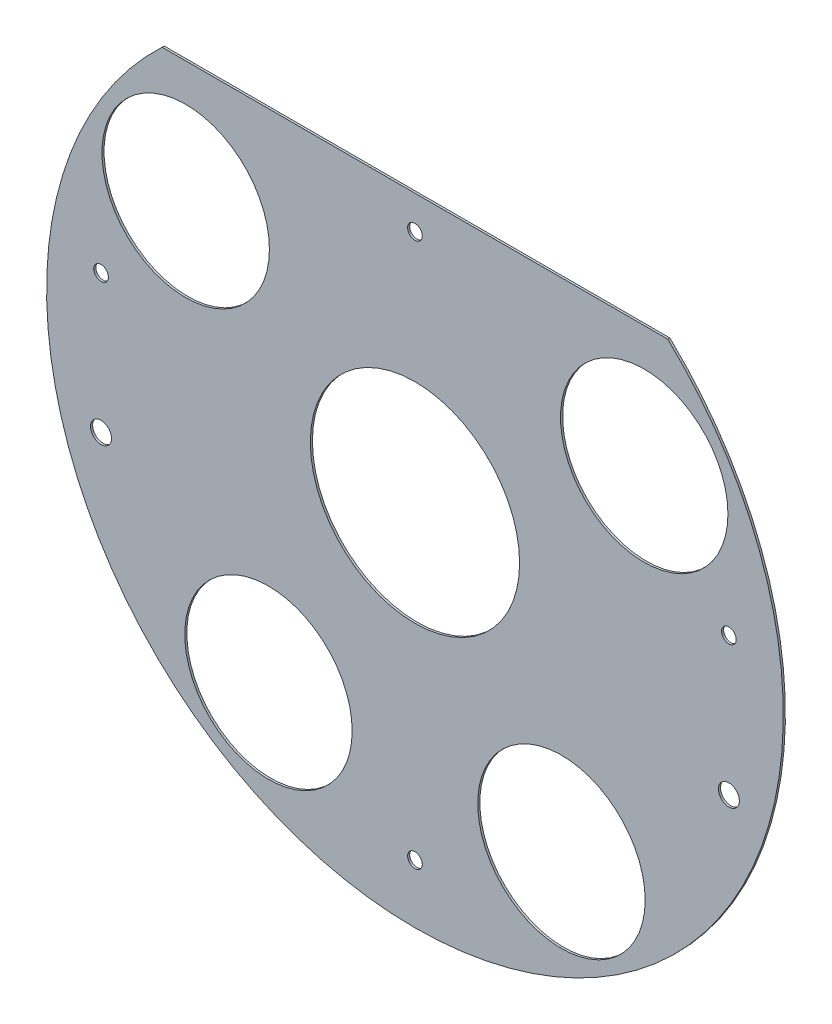
ISO-10303-21;
HEADER;
FILE_DESCRIPTION(('STEP AP214'),'2;1');
FILE_NAME('part.step','',(''),(''),'','','');
FILE_SCHEMA(('AUTOMOTIVE_DESIGN { 1 0 10303 214 1 1 1 1 }'));
ENDSEC;
DATA;
#1=APPLICATION_CONTEXT('core data for automotive mechanical design processes');
#2=APPLICATION_PROTOCOL_DEFINITION('international standard','automotive_design',2000,#1);
#3=PRODUCT_CONTEXT('',#1,'mechanical');
#4=PRODUCT('Part','Part','',(#3));
#5=PRODUCT_RELATED_PRODUCT_CATEGORY('part','',(#4));
#6=PRODUCT_DEFINITION_FORMATION('','',#4);
#7=PRODUCT_DEFINITION_CONTEXT('part definition',#1,'design');
#8=PRODUCT_DEFINITION('design','',#6,#7);
#9=PRODUCT_DEFINITION_SHAPE('','',#8);
#10=(LENGTH_UNIT() NAMED_UNIT(*) SI_UNIT(.MILLI.,.METRE.));
#11=(NAMED_UNIT(*) PLANE_ANGLE_UNIT() SI_UNIT($,.RADIAN.));
#12=(NAMED_UNIT(*) SI_UNIT($,.STERADIAN.) SOLID_ANGLE_UNIT());
#13=UNCERTAINTY_MEASURE_WITH_UNIT(LENGTH_MEASURE(1.E-05),#10,'distance_accuracy_value','');
#14=(GEOMETRIC_REPRESENTATION_CONTEXT(3) GLOBAL_UNCERTAINTY_ASSIGNED_CONTEXT((#13)) GLOBAL_UNIT_ASSIGNED_CONTEXT((#10,
#11,#12)) REPRESENTATION_CONTEXT('',''));
#15=CARTESIAN_POINT('',(0.,0.,0.));
#16=DIRECTION('',(0.,0.,1.));
#17=DIRECTION('',(1.,0.,0.));
#18=AXIS2_PLACEMENT_3D('',#15,#16,#17);
#19=CARTESIAN_POINT('',(0.,0.,0.5));
#20=DIRECTION('',(0.,0.,1.));
#21=DIRECTION('',(1.,0.,0.));
#22=AXIS2_PLACEMENT_3D('',#19,#20,#21);
#23=PLANE('',#22);
#24=CARTESIAN_POINT('',(-75.,-23.,0.5));
#25=DIRECTION('',(0.,0.,1.));
#26=DIRECTION('',(1.,0.,0.));
#27=AXIS2_PLACEMENT_3D('',#24,#25,#26);
#28=CIRCLE('',#27,2.50000000000001);
#29=CARTESIAN_POINT('',(-72.5,-23.,0.5));
#30=VERTEX_POINT('',#29);
#31=EDGE_CURVE('E138',#30,#30,#28,.T.);
#32=ORIENTED_EDGE('',*,*,#31,.F.);
#33=EDGE_LOOP('',(#32));
#34=FACE_BOUND('',#33,.T.);
#35=CARTESIAN_POINT('',(0.,-74.,0.5));
#36=DIRECTION('',(0.,0.,1.));
#37=DIRECTION('',(1.,0.,0.));
#38=AXIS2_PLACEMENT_3D('',#35,#36,#37);
#39=CIRCLE('',#38,1.75);
#40=CARTESIAN_POINT('',(1.75,-74.,0.5));
#41=VERTEX_POINT('',#40);
#42=EDGE_CURVE('E125',#41,#41,#39,.T.);
#43=ORIENTED_EDGE('',*,*,#42,.F.);
#44=EDGE_LOOP('',(#43));
#45=FACE_BOUND('',#44,.T.);
#46=CARTESIAN_POINT('',(-75.,10.,0.5));
#47=DIRECTION('',(0.,0.,1.));
#48=DIRECTION('',(1.,0.,0.));
#49=AXIS2_PLACEMENT_3D('',#46,#47,#48);
#50=CIRCLE('',#49,1.75000000000001);
#51=CARTESIAN_POINT('',(-73.25,10.,0.5));
#52=VERTEX_POINT('',#51);
#53=EDGE_CURVE('E113',#52,#52,#50,.T.);
#54=ORIENTED_EDGE('',*,*,#53,.F.);
#55=EDGE_LOOP('',(#54));
#56=FACE_BOUND('',#55,.T.);
#57=CARTESIAN_POINT('',(54.7722557505166,35.,0.5));
#58=DIRECTION('',(0.,0.,1.));
#59=DIRECTION('',(1.,0.,0.));
#60=AXIS2_PLACEMENT_3D('',#57,#58,#59);
#61=CIRCLE('',#60,20.);
#62=CARTESIAN_POINT('',(74.7722557505166,35.,0.5));
#63=VERTEX_POINT('',#62);
#64=EDGE_CURVE('E100',#63,#63,#61,.T.);
#65=ORIENTED_EDGE('',*,*,#64,.F.);
#66=EDGE_LOOP('',(#65));
#67=FACE_BOUND('',#66,.T.);
#68=CARTESIAN_POINT('',(-35.,-54.7722557505166,0.5));
#69=DIRECTION('',(0.,0.,1.));
#70=DIRECTION('',(1.,0.,0.));
#71=AXIS2_PLACEMENT_3D('',#68,#69,#70);
#72=CIRCLE('',#71,20.);
#73=CARTESIAN_POINT('',(-15.,-54.7722557505166,0.5));
#74=VERTEX_POINT('',#73);
#75=EDGE_CURVE('E89',#74,#74,#72,.T.);
#76=ORIENTED_EDGE('',*,*,#75,.F.);
#77=EDGE_LOOP('',(#76));
#78=FACE_BOUND('',#77,.T.);
#79=CARTESIAN_POINT('',(0.,0.,0.5));
#80=DIRECTION('',(0.,0.,1.));
#81=DIRECTION('',(1.,0.,0.));
#82=AXIS2_PLACEMENT_3D('',#79,#80,#81);
#83=CIRCLE('',#82,88.);
#84=CARTESIAN_POINT('',(-60.398675482166,64.,0.5));
#85=VERTEX_POINT('',#84);
#86=CARTESIAN_POINT('',(60.398675482166,64.,0.5));
#87=VERTEX_POINT('',#86);
#88=EDGE_CURVE('E71',#85,#87,#83,.T.);
#89=ORIENTED_EDGE('',*,*,#88,.T.);
#90=DIRECTION('',(-1.,0.,0.));
#91=VECTOR('',#90,1.);
#92=CARTESIAN_POINT('',(-60.398675482166,64.,0.5));
#93=LINE('',#92,#91);
#94=EDGE_CURVE('E56',#87,#85,#93,.T.);
#95=ORIENTED_EDGE('',*,*,#94,.T.);
#96=EDGE_LOOP('',(#89,#95));
#97=FACE_BOUND('',#96,.T.);
#98=CARTESIAN_POINT('',(0.,0.,0.5));
#99=DIRECTION('',(0.,0.,1.));
#100=DIRECTION('',(1.,0.,0.));
#101=AXIS2_PLACEMENT_3D('',#98,#99,#100);
#102=CIRCLE('',#101,25.);
#103=CARTESIAN_POINT('',(25.,0.,0.5));
#104=VERTEX_POINT('',#103);
#105=EDGE_CURVE('E78',#104,#104,#102,.T.);
#106=ORIENTED_EDGE('',*,*,#105,.F.);
#107=EDGE_LOOP('',(#106));
#108=FACE_BOUND('',#107,.T.);
#109=CARTESIAN_POINT('',(-54.7722557505166,35.,0.5));
#110=DIRECTION('',(0.,0.,1.));
#111=DIRECTION('',(1.,0.,0.));
#112=AXIS2_PLACEMENT_3D('',#109,#110,#111);
#113=CIRCLE('',#112,20.);
#114=CARTESIAN_POINT('',(-34.7722557505166,35.,0.5));
#115=VERTEX_POINT('',#114);
#116=EDGE_CURVE('E94',#115,#115,#113,.T.);
#117=ORIENTED_EDGE('',*,*,#116,.F.);
#118=EDGE_LOOP('',(#117));
#119=FACE_BOUND('',#118,.T.);
#120=CARTESIAN_POINT('',(35.,-54.7722557505166,0.5));
#121=DIRECTION('',(0.,0.,1.));
#122=DIRECTION('',(1.,0.,0.));
#123=AXIS2_PLACEMENT_3D('',#120,#121,#122);
#124=CIRCLE('',#123,20.);
#125=CARTESIAN_POINT('',(55.,-54.7722557505166,0.5));
#126=VERTEX_POINT('',#125);
#127=EDGE_CURVE('E107',#126,#126,#124,.T.);
#128=ORIENTED_EDGE('',*,*,#127,.F.);
#129=EDGE_LOOP('',(#128));
#130=FACE_BOUND('',#129,.T.);
#131=CARTESIAN_POINT('',(0.,56.,0.5));
#132=DIRECTION('',(0.,0.,1.));
#133=DIRECTION('',(1.,0.,0.));
#134=AXIS2_PLACEMENT_3D('',#131,#132,#133);
#135=CIRCLE('',#134,1.75);
#136=CARTESIAN_POINT('',(1.75,56.,0.5));
#137=VERTEX_POINT('',#136);
#138=EDGE_CURVE('E119',#137,#137,#135,.T.);
#139=ORIENTED_EDGE('',*,*,#138,.F.);
#140=EDGE_LOOP('',(#139));
#141=FACE_BOUND('',#140,.T.);
#142=CARTESIAN_POINT('',(75.,10.,0.5));
#143=DIRECTION('',(0.,0.,1.));
#144=DIRECTION('',(1.,0.,0.));
#145=AXIS2_PLACEMENT_3D('',#142,#143,#144);
#146=CIRCLE('',#145,1.75);
#147=CARTESIAN_POINT('',(76.75,10.,0.5));
#148=VERTEX_POINT('',#147);
#149=EDGE_CURVE('E131',#148,#148,#146,.T.);
#150=ORIENTED_EDGE('',*,*,#149,.F.);
#151=EDGE_LOOP('',(#150));
#152=FACE_BOUND('',#151,.T.);
#153=CARTESIAN_POINT('',(75.,-23.,0.5));
#154=DIRECTION('',(0.,0.,1.));
#155=DIRECTION('',(1.,0.,0.));
#156=AXIS2_PLACEMENT_3D('',#153,#154,#155);
#157=CIRCLE('',#156,2.50000000000001);
#158=CARTESIAN_POINT('',(77.5,-23.,0.5));
#159=VERTEX_POINT('',#158);
#160=EDGE_CURVE('E145',#159,#159,#157,.T.);
#161=ORIENTED_EDGE('',*,*,#160,.F.);
#162=EDGE_LOOP('',(#161));
#163=FACE_BOUND('',#162,.T.);
#164=ADVANCED_FACE('F40',(#34,#45,#56,#67,#78,#97,#108,#119,#130,#141,#152,#163),#23,.T.);
#165=CARTESIAN_POINT('',(0.,0.,0.));
#166=DIRECTION('',(0.,0.,1.));
#167=DIRECTION('',(1.,0.,0.));
#168=AXIS2_PLACEMENT_3D('',#165,#166,#167);
#169=PLANE('',#168);
#170=CARTESIAN_POINT('',(0.,0.,0.));
#171=DIRECTION('',(0.,0.,1.));
#172=DIRECTION('',(1.,0.,0.));
#173=AXIS2_PLACEMENT_3D('',#170,#171,#172);
#174=CIRCLE('',#173,88.);
#175=CARTESIAN_POINT('',(-60.398675482166,64.,0.));
#176=VERTEX_POINT('',#175);
#177=CARTESIAN_POINT('',(60.398675482166,64.,0.));
#178=VERTEX_POINT('',#177);
#179=EDGE_CURVE('E72',#176,#178,#174,.T.);
#180=ORIENTED_EDGE('',*,*,#179,.F.);
#181=DIRECTION('',(-1.,0.,0.));
#182=VECTOR('',#181,1.);
#183=CARTESIAN_POINT('',(-60.398675482166,64.,0.));
#184=LINE('',#183,#182);
#185=EDGE_CURVE('E64',#178,#176,#184,.T.);
#186=ORIENTED_EDGE('',*,*,#185,.F.);
#187=EDGE_LOOP('',(#180,#186));
#188=FACE_BOUND('',#187,.T.);
#189=CARTESIAN_POINT('',(0.,0.,0.));
#190=DIRECTION('',(0.,0.,1.));
#191=DIRECTION('',(1.,0.,0.));
#192=AXIS2_PLACEMENT_3D('',#189,#190,#191);
#193=CIRCLE('',#192,25.);
#194=CARTESIAN_POINT('',(25.,0.,0.));
#195=VERTEX_POINT('',#194);
#196=EDGE_CURVE('E83',#195,#195,#193,.T.);
#197=ORIENTED_EDGE('',*,*,#196,.T.);
#198=EDGE_LOOP('',(#197));
#199=FACE_BOUND('',#198,.T.);
#200=CARTESIAN_POINT('',(-35.,-54.7722557505166,0.));
#201=DIRECTION('',(0.,0.,1.));
#202=DIRECTION('',(1.,0.,0.));
#203=AXIS2_PLACEMENT_3D('',#200,#201,#202);
#204=CIRCLE('',#203,20.);
#205=CARTESIAN_POINT('',(-15.,-54.7722557505166,0.));
#206=VERTEX_POINT('',#205);
#207=EDGE_CURVE('E91',#206,#206,#204,.T.);
#208=ORIENTED_EDGE('',*,*,#207,.T.);
#209=EDGE_LOOP('',(#208));
#210=FACE_BOUND('',#209,.T.);
#211=CARTESIAN_POINT('',(-54.7722557505166,35.,0.));
#212=DIRECTION('',(0.,0.,1.));
#213=DIRECTION('',(1.,0.,0.));
#214=AXIS2_PLACEMENT_3D('',#211,#212,#213);
#215=CIRCLE('',#214,20.);
#216=CARTESIAN_POINT('',(-34.7722557505166,35.,0.));
#217=VERTEX_POINT('',#216);
#218=EDGE_CURVE('E97',#217,#217,#215,.T.);
#219=ORIENTED_EDGE('',*,*,#218,.T.);
#220=EDGE_LOOP('',(#219));
#221=FACE_BOUND('',#220,.T.);
#222=CARTESIAN_POINT('',(54.7722557505166,35.,0.));
#223=DIRECTION('',(0.,0.,1.));
#224=DIRECTION('',(1.,0.,0.));
#225=AXIS2_PLACEMENT_3D('',#222,#223,#224);
#226=CIRCLE('',#225,20.);
#227=CARTESIAN_POINT('',(74.7722557505166,35.,0.));
#228=VERTEX_POINT('',#227);
#229=EDGE_CURVE('E103',#228,#228,#226,.T.);
#230=ORIENTED_EDGE('',*,*,#229,.T.);
#231=EDGE_LOOP('',(#230));
#232=FACE_BOUND('',#231,.T.);
#233=CARTESIAN_POINT('',(35.,-54.7722557505166,0.));
#234=DIRECTION('',(0.,0.,1.));
#235=DIRECTION('',(1.,0.,0.));
#236=AXIS2_PLACEMENT_3D('',#233,#234,#235);
#237=CIRCLE('',#236,20.);
#238=CARTESIAN_POINT('',(55.,-54.7722557505166,0.));
#239=VERTEX_POINT('',#238);
#240=EDGE_CURVE('E110',#239,#239,#237,.T.);
#241=ORIENTED_EDGE('',*,*,#240,.T.);
#242=EDGE_LOOP('',(#241));
#243=FACE_BOUND('',#242,.T.);
#244=CARTESIAN_POINT('',(-75.,10.,0.));
#245=DIRECTION('',(0.,0.,1.));
#246=DIRECTION('',(1.,0.,0.));
#247=AXIS2_PLACEMENT_3D('',#244,#245,#246);
#248=CIRCLE('',#247,1.75000000000001);
#249=CARTESIAN_POINT('',(-73.25,10.,0.));
#250=VERTEX_POINT('',#249);
#251=EDGE_CURVE('E116',#250,#250,#248,.T.);
#252=ORIENTED_EDGE('',*,*,#251,.T.);
#253=EDGE_LOOP('',(#252));
#254=FACE_BOUND('',#253,.T.);
#255=CARTESIAN_POINT('',(0.,56.,0.));
#256=DIRECTION('',(0.,0.,1.));
#257=DIRECTION('',(1.,0.,0.));
#258=AXIS2_PLACEMENT_3D('',#255,#256,#257);
#259=CIRCLE('',#258,1.75);
#260=CARTESIAN_POINT('',(1.75,56.,0.));
#261=VERTEX_POINT('',#260);
#262=EDGE_CURVE('E122',#261,#261,#259,.T.);
#263=ORIENTED_EDGE('',*,*,#262,.T.);
#264=EDGE_LOOP('',(#263));
#265=FACE_BOUND('',#264,.T.);
#266=CARTESIAN_POINT('',(0.,-74.,0.));
#267=DIRECTION('',(0.,0.,1.));
#268=DIRECTION('',(1.,0.,0.));
#269=AXIS2_PLACEMENT_3D('',#266,#267,#268);
#270=CIRCLE('',#269,1.75);
#271=CARTESIAN_POINT('',(1.75,-74.,0.));
#272=VERTEX_POINT('',#271);
#273=EDGE_CURVE('E128',#272,#272,#270,.T.);
#274=ORIENTED_EDGE('',*,*,#273,.T.);
#275=EDGE_LOOP('',(#274));
#276=FACE_BOUND('',#275,.T.);
#277=CARTESIAN_POINT('',(75.,10.,0.));
#278=DIRECTION('',(0.,0.,1.));
#279=DIRECTION('',(1.,0.,0.));
#280=AXIS2_PLACEMENT_3D('',#277,#278,#279);
#281=CIRCLE('',#280,1.75);
#282=CARTESIAN_POINT('',(76.75,10.,0.));
#283=VERTEX_POINT('',#282);
#284=EDGE_CURVE('E134',#283,#283,#281,.T.);
#285=ORIENTED_EDGE('',*,*,#284,.T.);
#286=EDGE_LOOP('',(#285));
#287=FACE_BOUND('',#286,.T.);
#288=CARTESIAN_POINT('',(-75.,-23.,0.));
#289=DIRECTION('',(0.,0.,1.));
#290=DIRECTION('',(1.,0.,0.));
#291=AXIS2_PLACEMENT_3D('',#288,#289,#290);
#292=CIRCLE('',#291,2.50000000000001);
#293=CARTESIAN_POINT('',(-72.5,-23.,0.));
#294=VERTEX_POINT('',#293);
#295=EDGE_CURVE('E142',#294,#294,#292,.T.);
#296=ORIENTED_EDGE('',*,*,#295,.T.);
#297=EDGE_LOOP('',(#296));
#298=FACE_BOUND('',#297,.T.);
#299=CARTESIAN_POINT('',(75.,-23.,0.));
#300=DIRECTION('',(0.,0.,1.));
#301=DIRECTION('',(1.,0.,0.));
#302=AXIS2_PLACEMENT_3D('',#299,#300,#301);
#303=CIRCLE('',#302,2.50000000000001);
#304=CARTESIAN_POINT('',(77.5,-23.,0.));
#305=VERTEX_POINT('',#304);
#306=EDGE_CURVE('E148',#305,#305,#303,.T.);
#307=ORIENTED_EDGE('',*,*,#306,.T.);
#308=EDGE_LOOP('',(#307));
#309=FACE_BOUND('',#308,.T.);
#310=ADVANCED_FACE('F75',(#188,#199,#210,#221,#232,#243,#254,#265,#276,#287,#298,#309),#169,.F.);
#311=CARTESIAN_POINT('',(0.,0.,0.5));
#312=DIRECTION('',(0.,0.,-1.));
#313=DIRECTION('',(-1.,0.,0.));
#314=AXIS2_PLACEMENT_3D('',#311,#312,#313);
#315=CYLINDRICAL_SURFACE('',#314,88.);
#316=ORIENTED_EDGE('',*,*,#179,.T.);
#317=DIRECTION('',(0.,0.,-1.));
#318=VECTOR('',#317,1.);
#319=CARTESIAN_POINT('',(60.398675482166,64.,0.5));
#320=LINE('',#319,#318);
#321=EDGE_CURVE('E11',#87,#178,#320,.T.);
#322=ORIENTED_EDGE('',*,*,#321,.F.);
#323=ORIENTED_EDGE('',*,*,#88,.F.);
#324=DIRECTION('',(0.,0.,-1.));
#325=VECTOR('',#324,1.);
#326=CARTESIAN_POINT('',(-60.398675482166,64.,0.5));
#327=LINE('',#326,#325);
#328=EDGE_CURVE('E49',#85,#176,#327,.T.);
#329=ORIENTED_EDGE('',*,*,#328,.T.);
#330=EDGE_LOOP('',(#316,#322,#323,#329));
#331=FACE_BOUND('',#330,.T.);
#332=ADVANCED_FACE('F42',(#331),#315,.T.);
#333=CARTESIAN_POINT('',(-60.398675482166,64.,0.5));
#334=DIRECTION('',(0.,-1.,0.));
#335=DIRECTION('',(0.,0.,-1.));
#336=AXIS2_PLACEMENT_3D('',#333,#334,#335);
#337=PLANE('',#336);
#338=ORIENTED_EDGE('',*,*,#185,.T.);
#339=ORIENTED_EDGE('',*,*,#328,.F.);
#340=ORIENTED_EDGE('',*,*,#94,.F.);
#341=ORIENTED_EDGE('',*,*,#321,.T.);
#342=EDGE_LOOP('',(#338,#339,#340,#341));
#343=FACE_BOUND('',#342,.T.);
#344=ADVANCED_FACE('F67',(#343),#337,.F.);
#345=CARTESIAN_POINT('',(0.,0.,0.5));
#346=DIRECTION('',(0.,0.,-1.));
#347=DIRECTION('',(-1.,0.,0.));
#348=AXIS2_PLACEMENT_3D('',#345,#346,#347);
#349=CYLINDRICAL_SURFACE('',#348,25.);
#350=ORIENTED_EDGE('',*,*,#105,.T.);
#351=EDGE_LOOP('',(#350));
#352=FACE_BOUND('',#351,.T.);
#353=ORIENTED_EDGE('',*,*,#196,.F.);
#354=EDGE_LOOP('',(#353));
#355=FACE_BOUND('',#354,.T.);
#356=ADVANCED_FACE('F167',(#352,#355),#349,.F.);
#357=CARTESIAN_POINT('',(-35.,-54.7722557505166,0.5));
#358=DIRECTION('',(0.,0.,-1.));
#359=DIRECTION('',(-1.,0.,0.));
#360=AXIS2_PLACEMENT_3D('',#357,#358,#359);
#361=CYLINDRICAL_SURFACE('',#360,20.);
#362=ORIENTED_EDGE('',*,*,#75,.T.);
#363=EDGE_LOOP('',(#362));
#364=FACE_BOUND('',#363,.T.);
#365=ORIENTED_EDGE('',*,*,#207,.F.);
#366=EDGE_LOOP('',(#365));
#367=FACE_BOUND('',#366,.T.);
#368=ADVANCED_FACE('F174',(#364,#367),#361,.F.);
#369=CARTESIAN_POINT('',(-54.7722557505166,35.,0.5));
#370=DIRECTION('',(0.,0.,-1.));
#371=DIRECTION('',(-1.,0.,0.));
#372=AXIS2_PLACEMENT_3D('',#369,#370,#371);
#373=CYLINDRICAL_SURFACE('',#372,20.);
#374=ORIENTED_EDGE('',*,*,#116,.T.);
#375=EDGE_LOOP('',(#374));
#376=FACE_BOUND('',#375,.T.);
#377=ORIENTED_EDGE('',*,*,#218,.F.);
#378=EDGE_LOOP('',(#377));
#379=FACE_BOUND('',#378,.T.);
#380=ADVANCED_FACE('F209',(#376,#379),#373,.F.);
#381=CARTESIAN_POINT('',(54.7722557505166,35.,0.5));
#382=DIRECTION('',(0.,0.,-1.));
#383=DIRECTION('',(-1.,0.,0.));
#384=AXIS2_PLACEMENT_3D('',#381,#382,#383);
#385=CYLINDRICAL_SURFACE('',#384,20.);
#386=ORIENTED_EDGE('',*,*,#64,.T.);
#387=EDGE_LOOP('',(#386));
#388=FACE_BOUND('',#387,.T.);
#389=ORIENTED_EDGE('',*,*,#229,.F.);
#390=EDGE_LOOP('',(#389));
#391=FACE_BOUND('',#390,.T.);
#392=ADVANCED_FACE('F217',(#388,#391),#385,.F.);
#393=CARTESIAN_POINT('',(35.,-54.7722557505166,0.5));
#394=DIRECTION('',(0.,0.,-1.));
#395=DIRECTION('',(-1.,0.,0.));
#396=AXIS2_PLACEMENT_3D('',#393,#394,#395);
#397=CYLINDRICAL_SURFACE('',#396,20.);
#398=ORIENTED_EDGE('',*,*,#127,.T.);
#399=EDGE_LOOP('',(#398));
#400=FACE_BOUND('',#399,.T.);
#401=ORIENTED_EDGE('',*,*,#240,.F.);
#402=EDGE_LOOP('',(#401));
#403=FACE_BOUND('',#402,.T.);
#404=ADVANCED_FACE('F226',(#400,#403),#397,.F.);
#405=CARTESIAN_POINT('',(-75.,10.,0.5));
#406=DIRECTION('',(0.,0.,-1.));
#407=DIRECTION('',(-1.,0.,0.));
#408=AXIS2_PLACEMENT_3D('',#405,#406,#407);
#409=CYLINDRICAL_SURFACE('',#408,1.75000000000001);
#410=ORIENTED_EDGE('',*,*,#53,.T.);
#411=EDGE_LOOP('',(#410));
#412=FACE_BOUND('',#411,.T.);
#413=ORIENTED_EDGE('',*,*,#251,.F.);
#414=EDGE_LOOP('',(#413));
#415=FACE_BOUND('',#414,.T.);
#416=ADVANCED_FACE('F235',(#412,#415),#409,.F.);
#417=CARTESIAN_POINT('',(0.,56.,0.5));
#418=DIRECTION('',(0.,0.,-1.));
#419=DIRECTION('',(-1.,0.,0.));
#420=AXIS2_PLACEMENT_3D('',#417,#418,#419);
#421=CYLINDRICAL_SURFACE('',#420,1.75);
#422=ORIENTED_EDGE('',*,*,#138,.T.);
#423=EDGE_LOOP('',(#422));
#424=FACE_BOUND('',#423,.T.);
#425=ORIENTED_EDGE('',*,*,#262,.F.);
#426=EDGE_LOOP('',(#425));
#427=FACE_BOUND('',#426,.T.);
#428=ADVANCED_FACE('F244',(#424,#427),#421,.F.);
#429=CARTESIAN_POINT('',(0.,-74.,0.5));
#430=DIRECTION('',(0.,0.,-1.));
#431=DIRECTION('',(-1.,0.,0.));
#432=AXIS2_PLACEMENT_3D('',#429,#430,#431);
#433=CYLINDRICAL_SURFACE('',#432,1.75);
#434=ORIENTED_EDGE('',*,*,#42,.T.);
#435=EDGE_LOOP('',(#434));
#436=FACE_BOUND('',#435,.T.);
#437=ORIENTED_EDGE('',*,*,#273,.F.);
#438=EDGE_LOOP('',(#437));
#439=FACE_BOUND('',#438,.T.);
#440=ADVANCED_FACE('F253',(#436,#439),#433,.F.);
#441=CARTESIAN_POINT('',(75.,10.,0.5));
#442=DIRECTION('',(0.,0.,-1.));
#443=DIRECTION('',(-1.,0.,0.));
#444=AXIS2_PLACEMENT_3D('',#441,#442,#443);
#445=CYLINDRICAL_SURFACE('',#444,1.75);
#446=ORIENTED_EDGE('',*,*,#149,.T.);
#447=EDGE_LOOP('',(#446));
#448=FACE_BOUND('',#447,.T.);
#449=ORIENTED_EDGE('',*,*,#284,.F.);
#450=EDGE_LOOP('',(#449));
#451=FACE_BOUND('',#450,.T.);
#452=ADVANCED_FACE('F262',(#448,#451),#445,.F.);
#453=CARTESIAN_POINT('',(-75.,-23.,0.5));
#454=DIRECTION('',(0.,0.,-1.));
#455=DIRECTION('',(-1.,0.,0.));
#456=AXIS2_PLACEMENT_3D('',#453,#454,#455);
#457=CYLINDRICAL_SURFACE('',#456,2.50000000000001);
#458=ORIENTED_EDGE('',*,*,#31,.T.);
#459=EDGE_LOOP('',(#458));
#460=FACE_BOUND('',#459,.T.);
#461=ORIENTED_EDGE('',*,*,#295,.F.);
#462=EDGE_LOOP('',(#461));
#463=FACE_BOUND('',#462,.T.);
#464=ADVANCED_FACE('F271',(#460,#463),#457,.F.);
#465=CARTESIAN_POINT('',(75.,-23.,0.5));
#466=DIRECTION('',(0.,0.,-1.));
#467=DIRECTION('',(-1.,0.,0.));
#468=AXIS2_PLACEMENT_3D('',#465,#466,#467);
#469=CYLINDRICAL_SURFACE('',#468,2.50000000000001);
#470=ORIENTED_EDGE('',*,*,#160,.T.);
#471=EDGE_LOOP('',(#470));
#472=FACE_BOUND('',#471,.T.);
#473=ORIENTED_EDGE('',*,*,#306,.F.);
#474=EDGE_LOOP('',(#473));
#475=FACE_BOUND('',#474,.T.);
#476=ADVANCED_FACE('F154',(#472,#475),#469,.F.);
#477=CLOSED_SHELL('',(#164,#310,#332,#344,#356,#368,#380,#392,#404,#416,#428,#440,#452,#464,#476));
#478=MANIFOLD_SOLID_BREP('B2',#477);
#479=ADVANCED_BREP_SHAPE_REPRESENTATION('',(#18,#478),#14);
#480=SHAPE_DEFINITION_REPRESENTATION(#9,#479);
ENDSEC;
END-ISO-10303-21;
